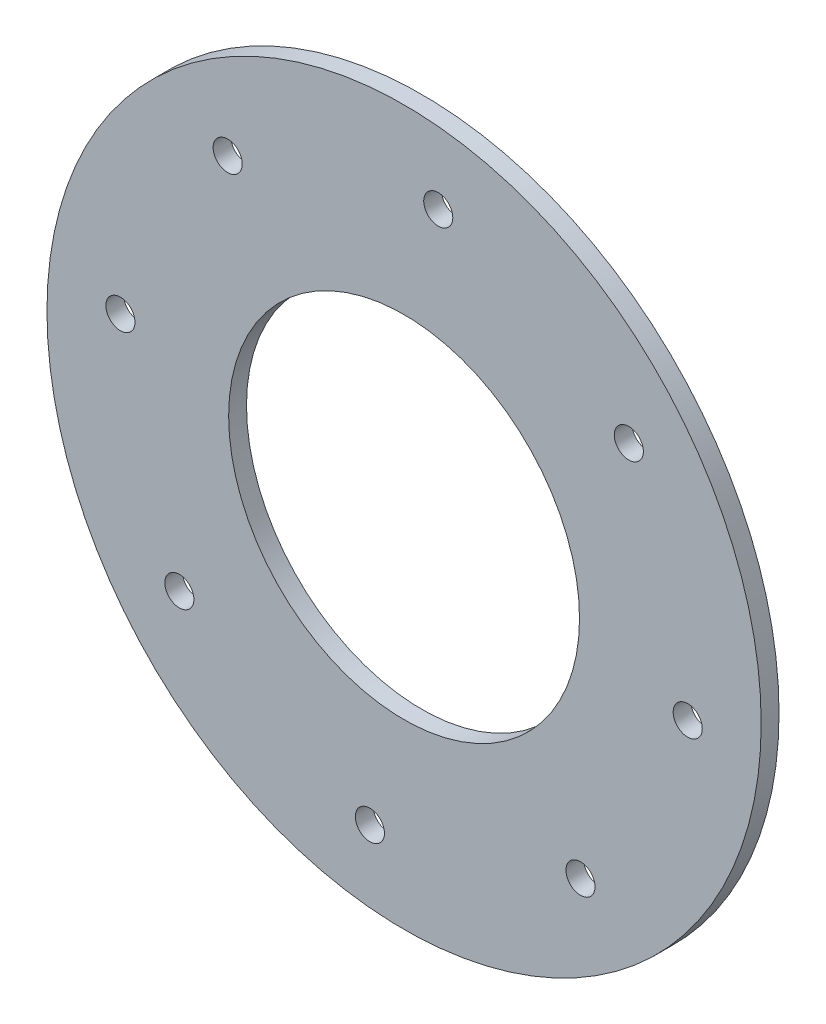
ISO-10303-21;
HEADER;
FILE_DESCRIPTION(('STEP AP214'),'2;1');
FILE_NAME('part.step','',(''),(''),'','','');
FILE_SCHEMA(('AUTOMOTIVE_DESIGN { 1 0 10303 214 1 1 1 1 }'));
ENDSEC;
DATA;
#1=APPLICATION_CONTEXT('core data for automotive mechanical design processes');
#2=APPLICATION_PROTOCOL_DEFINITION('international standard','automotive_design',2000,#1);
#3=PRODUCT_CONTEXT('',#1,'mechanical');
#4=PRODUCT('Part','Part','',(#3));
#5=PRODUCT_RELATED_PRODUCT_CATEGORY('part','',(#4));
#6=PRODUCT_DEFINITION_FORMATION('','',#4);
#7=PRODUCT_DEFINITION_CONTEXT('part definition',#1,'design');
#8=PRODUCT_DEFINITION('design','',#6,#7);
#9=PRODUCT_DEFINITION_SHAPE('','',#8);
#10=(LENGTH_UNIT() NAMED_UNIT(*) SI_UNIT(.MILLI.,.METRE.));
#11=(NAMED_UNIT(*) PLANE_ANGLE_UNIT() SI_UNIT($,.RADIAN.));
#12=(NAMED_UNIT(*) SI_UNIT($,.STERADIAN.) SOLID_ANGLE_UNIT());
#13=UNCERTAINTY_MEASURE_WITH_UNIT(LENGTH_MEASURE(1.E-05),#10,'distance_accuracy_value','');
#14=(GEOMETRIC_REPRESENTATION_CONTEXT(3) GLOBAL_UNCERTAINTY_ASSIGNED_CONTEXT((#13)) GLOBAL_UNIT_ASSIGNED_CONTEXT((#10,
#11,#12)) REPRESENTATION_CONTEXT('',''));
#15=CARTESIAN_POINT('',(0.,0.,0.));
#16=DIRECTION('',(0.,0.,1.));
#17=DIRECTION('',(1.,0.,0.));
#18=AXIS2_PLACEMENT_3D('',#15,#16,#17);
#19=CARTESIAN_POINT('',(0.,0.,3.));
#20=DIRECTION('',(0.,0.,1.));
#21=DIRECTION('',(1.,0.,0.));
#22=AXIS2_PLACEMENT_3D('',#19,#20,#21);
#23=PLANE('',#22);
#24=CARTESIAN_POINT('',(-37.7582746187648,-29.6363408303649,3.));
#25=DIRECTION('',(0.,0.,1.));
#26=DIRECTION('',(1.,0.,0.));
#27=AXIS2_PLACEMENT_3D('',#24,#25,#26);
#28=CIRCLE('',#27,2.44394443382312);
#29=CARTESIAN_POINT('',(-35.3143301849417,-29.6363408303649,3.));
#30=VERTEX_POINT('',#29);
#31=EDGE_CURVE('E108',#30,#30,#28,.T.);
#32=ORIENTED_EDGE('',*,*,#31,.F.);
#33=EDGE_LOOP('',(#32));
#34=FACE_BOUND('',#33,.T.);
#35=CARTESIAN_POINT('',(29.6363408303706,-37.7582746187655,3.));
#36=DIRECTION('',(0.,0.,1.));
#37=DIRECTION('',(1.,0.,0.));
#38=AXIS2_PLACEMENT_3D('',#35,#36,#37);
#39=CIRCLE('',#38,2.44394443382819);
#40=CARTESIAN_POINT('',(32.0802852641988,-37.7582746187655,3.));
#41=VERTEX_POINT('',#40);
#42=EDGE_CURVE('E92',#41,#41,#39,.T.);
#43=ORIENTED_EDGE('',*,*,#42,.F.);
#44=EDGE_LOOP('',(#43));
#45=FACE_BOUND('',#44,.T.);
#46=CARTESIAN_POINT('',(37.7582746187712,29.6363408303699,3.));
#47=DIRECTION('',(0.,0.,1.));
#48=DIRECTION('',(1.,0.,0.));
#49=AXIS2_PLACEMENT_3D('',#46,#47,#48);
#50=CIRCLE('',#49,2.44394443382569);
#51=CARTESIAN_POINT('',(40.2022190525969,29.6363408303699,3.));
#52=VERTEX_POINT('',#51);
#53=EDGE_CURVE('E76',#52,#52,#50,.T.);
#54=ORIENTED_EDGE('',*,*,#53,.F.);
#55=EDGE_LOOP('',(#54));
#56=FACE_BOUND('',#55,.T.);
#57=CARTESIAN_POINT('',(-29.6363408303642,37.7582746187705,3.));
#58=DIRECTION('',(0.,0.,1.));
#59=DIRECTION('',(1.,0.,0.));
#60=AXIS2_PLACEMENT_3D('',#57,#58,#59);
#61=CIRCLE('',#60,2.4439444338203);
#62=CARTESIAN_POINT('',(-27.1923963965439,37.7582746187705,3.));
#63=VERTEX_POINT('',#62);
#64=EDGE_CURVE('E60',#63,#63,#61,.T.);
#65=ORIENTED_EDGE('',*,*,#64,.F.);
#66=EDGE_LOOP('',(#65));
#67=FACE_BOUND('',#66,.T.);
#68=CARTESIAN_POINT('',(0.,0.,3.));
#69=DIRECTION('',(0.,0.,1.));
#70=DIRECTION('',(1.,0.,0.));
#71=AXIS2_PLACEMENT_3D('',#68,#69,#70);
#72=CIRCLE('',#71,60.);
#73=CARTESIAN_POINT('',(60.,0.,3.));
#74=VERTEX_POINT('',#73);
#75=EDGE_CURVE('E10',#74,#74,#72,.T.);
#76=ORIENTED_EDGE('',*,*,#75,.T.);
#77=EDGE_LOOP('',(#76));
#78=FACE_BOUND('',#77,.T.);
#79=CARTESIAN_POINT('',(0.,0.,3.));
#80=DIRECTION('',(0.,0.,1.));
#81=DIRECTION('',(1.,0.,0.));
#82=AXIS2_PLACEMENT_3D('',#79,#80,#81);
#83=CIRCLE('',#82,29.476887992267);
#84=CARTESIAN_POINT('',(29.476887992267,0.,3.));
#85=VERTEX_POINT('',#84);
#86=EDGE_CURVE('E54',#85,#85,#83,.T.);
#87=ORIENTED_EDGE('',*,*,#86,.F.);
#88=EDGE_LOOP('',(#87));
#89=FACE_BOUND('',#88,.T.);
#90=CARTESIAN_POINT('',(5.7430744581294,47.6551895995458,3.));
#91=DIRECTION('',(0.,0.,1.));
#92=DIRECTION('',(1.,0.,0.));
#93=AXIS2_PLACEMENT_3D('',#90,#91,#92);
#94=CIRCLE('',#93,2.4439444338225);
#95=CARTESIAN_POINT('',(8.1870188919519,47.6551895995458,3.));
#96=VERTEX_POINT('',#95);
#97=EDGE_CURVE('E68',#96,#96,#94,.T.);
#98=ORIENTED_EDGE('',*,*,#97,.F.);
#99=EDGE_LOOP('',(#98));
#100=FACE_BOUND('',#99,.T.);
#101=CARTESIAN_POINT('',(47.6551895995465,-5.74307445812371,3.));
#102=DIRECTION('',(0.,0.,1.));
#103=DIRECTION('',(1.,0.,0.));
#104=AXIS2_PLACEMENT_3D('',#101,#102,#103);
#105=CIRCLE('',#104,2.44394443382802);
#106=CARTESIAN_POINT('',(50.0991340333745,-5.74307445812371,3.));
#107=VERTEX_POINT('',#106);
#108=EDGE_CURVE('E84',#107,#107,#105,.T.);
#109=ORIENTED_EDGE('',*,*,#108,.F.);
#110=EDGE_LOOP('',(#109));
#111=FACE_BOUND('',#110,.T.);
#112=CARTESIAN_POINT('',(-5.743074458123,-47.6551895995408,3.));
#113=DIRECTION('',(0.,0.,1.));
#114=DIRECTION('',(1.,0.,0.));
#115=AXIS2_PLACEMENT_3D('',#112,#113,#114);
#116=CIRCLE('',#115,2.44394443382614);
#117=CARTESIAN_POINT('',(-3.29913002429685,-47.6551895995408,3.));
#118=VERTEX_POINT('',#117);
#119=EDGE_CURVE('E100',#118,#118,#116,.T.);
#120=ORIENTED_EDGE('',*,*,#119,.F.);
#121=EDGE_LOOP('',(#120));
#122=FACE_BOUND('',#121,.T.);
#123=CARTESIAN_POINT('',(-47.6551895995401,5.74307445812868,3.));
#124=DIRECTION('',(0.,0.,1.));
#125=DIRECTION('',(1.,0.,0.));
#126=AXIS2_PLACEMENT_3D('',#123,#124,#125);
#127=CIRCLE('',#126,2.44394443382094);
#128=CARTESIAN_POINT('',(-45.2112451657192,5.74307445812868,3.));
#129=VERTEX_POINT('',#128);
#130=EDGE_CURVE('E116',#129,#129,#127,.T.);
#131=ORIENTED_EDGE('',*,*,#130,.F.);
#132=EDGE_LOOP('',(#131));
#133=FACE_BOUND('',#132,.T.);
#134=ADVANCED_FACE('F41',(#34,#45,#56,#67,#78,#89,#100,#111,#122,#133),#23,.T.);
#135=CARTESIAN_POINT('',(0.,0.,0.));
#136=DIRECTION('',(0.,0.,1.));
#137=DIRECTION('',(1.,0.,0.));
#138=AXIS2_PLACEMENT_3D('',#135,#136,#137);
#139=PLANE('',#138);
#140=CARTESIAN_POINT('',(0.,0.,0.));
#141=DIRECTION('',(0.,0.,1.));
#142=DIRECTION('',(1.,0.,0.));
#143=AXIS2_PLACEMENT_3D('',#140,#141,#142);
#144=CIRCLE('',#143,60.);
#145=CARTESIAN_POINT('',(60.,0.,0.));
#146=VERTEX_POINT('',#145);
#147=EDGE_CURVE('E45',#146,#146,#144,.T.);
#148=ORIENTED_EDGE('',*,*,#147,.F.);
#149=EDGE_LOOP('',(#148));
#150=FACE_BOUND('',#149,.T.);
#151=CARTESIAN_POINT('',(0.,0.,0.));
#152=DIRECTION('',(0.,0.,1.));
#153=DIRECTION('',(1.,0.,0.));
#154=AXIS2_PLACEMENT_3D('',#151,#152,#153);
#155=CIRCLE('',#154,29.476887992267);
#156=CARTESIAN_POINT('',(29.476887992267,0.,0.));
#157=VERTEX_POINT('',#156);
#158=EDGE_CURVE('E56',#157,#157,#155,.T.);
#159=ORIENTED_EDGE('',*,*,#158,.T.);
#160=EDGE_LOOP('',(#159));
#161=FACE_BOUND('',#160,.T.);
#162=CARTESIAN_POINT('',(-29.6363408303642,37.7582746187705,0.));
#163=DIRECTION('',(0.,0.,1.));
#164=DIRECTION('',(1.,0.,0.));
#165=AXIS2_PLACEMENT_3D('',#162,#163,#164);
#166=CIRCLE('',#165,2.4439444338203);
#167=CARTESIAN_POINT('',(-27.1923963965439,37.7582746187705,0.));
#168=VERTEX_POINT('',#167);
#169=EDGE_CURVE('E64',#168,#168,#166,.T.);
#170=ORIENTED_EDGE('',*,*,#169,.T.);
#171=EDGE_LOOP('',(#170));
#172=FACE_BOUND('',#171,.T.);
#173=CARTESIAN_POINT('',(5.7430744581294,47.6551895995458,0.));
#174=DIRECTION('',(0.,0.,1.));
#175=DIRECTION('',(1.,0.,0.));
#176=AXIS2_PLACEMENT_3D('',#173,#174,#175);
#177=CIRCLE('',#176,2.4439444338225);
#178=CARTESIAN_POINT('',(8.1870188919519,47.6551895995458,0.));
#179=VERTEX_POINT('',#178);
#180=EDGE_CURVE('E72',#179,#179,#177,.T.);
#181=ORIENTED_EDGE('',*,*,#180,.T.);
#182=EDGE_LOOP('',(#181));
#183=FACE_BOUND('',#182,.T.);
#184=CARTESIAN_POINT('',(37.7582746187712,29.6363408303699,0.));
#185=DIRECTION('',(0.,0.,1.));
#186=DIRECTION('',(1.,0.,0.));
#187=AXIS2_PLACEMENT_3D('',#184,#185,#186);
#188=CIRCLE('',#187,2.44394443382569);
#189=CARTESIAN_POINT('',(40.2022190525969,29.6363408303699,0.));
#190=VERTEX_POINT('',#189);
#191=EDGE_CURVE('E80',#190,#190,#188,.T.);
#192=ORIENTED_EDGE('',*,*,#191,.T.);
#193=EDGE_LOOP('',(#192));
#194=FACE_BOUND('',#193,.T.);
#195=CARTESIAN_POINT('',(47.6551895995465,-5.74307445812371,0.));
#196=DIRECTION('',(0.,0.,1.));
#197=DIRECTION('',(1.,0.,0.));
#198=AXIS2_PLACEMENT_3D('',#195,#196,#197);
#199=CIRCLE('',#198,2.44394443382802);
#200=CARTESIAN_POINT('',(50.0991340333745,-5.74307445812371,0.));
#201=VERTEX_POINT('',#200);
#202=EDGE_CURVE('E88',#201,#201,#199,.T.);
#203=ORIENTED_EDGE('',*,*,#202,.T.);
#204=EDGE_LOOP('',(#203));
#205=FACE_BOUND('',#204,.T.);
#206=CARTESIAN_POINT('',(29.6363408303706,-37.7582746187655,0.));
#207=DIRECTION('',(0.,0.,1.));
#208=DIRECTION('',(1.,0.,0.));
#209=AXIS2_PLACEMENT_3D('',#206,#207,#208);
#210=CIRCLE('',#209,2.44394443382819);
#211=CARTESIAN_POINT('',(32.0802852641988,-37.7582746187655,0.));
#212=VERTEX_POINT('',#211);
#213=EDGE_CURVE('E96',#212,#212,#210,.T.);
#214=ORIENTED_EDGE('',*,*,#213,.T.);
#215=EDGE_LOOP('',(#214));
#216=FACE_BOUND('',#215,.T.);
#217=CARTESIAN_POINT('',(-5.743074458123,-47.6551895995408,0.));
#218=DIRECTION('',(0.,0.,1.));
#219=DIRECTION('',(1.,0.,0.));
#220=AXIS2_PLACEMENT_3D('',#217,#218,#219);
#221=CIRCLE('',#220,2.44394443382614);
#222=CARTESIAN_POINT('',(-3.29913002429685,-47.6551895995408,0.));
#223=VERTEX_POINT('',#222);
#224=EDGE_CURVE('E104',#223,#223,#221,.T.);
#225=ORIENTED_EDGE('',*,*,#224,.T.);
#226=EDGE_LOOP('',(#225));
#227=FACE_BOUND('',#226,.T.);
#228=CARTESIAN_POINT('',(-37.7582746187648,-29.6363408303649,0.));
#229=DIRECTION('',(0.,0.,1.));
#230=DIRECTION('',(1.,0.,0.));
#231=AXIS2_PLACEMENT_3D('',#228,#229,#230);
#232=CIRCLE('',#231,2.44394443382312);
#233=CARTESIAN_POINT('',(-35.3143301849417,-29.6363408303649,0.));
#234=VERTEX_POINT('',#233);
#235=EDGE_CURVE('E112',#234,#234,#232,.T.);
#236=ORIENTED_EDGE('',*,*,#235,.T.);
#237=EDGE_LOOP('',(#236));
#238=FACE_BOUND('',#237,.T.);
#239=CARTESIAN_POINT('',(-47.6551895995401,5.74307445812868,0.));
#240=DIRECTION('',(0.,0.,1.));
#241=DIRECTION('',(1.,0.,0.));
#242=AXIS2_PLACEMENT_3D('',#239,#240,#241);
#243=CIRCLE('',#242,2.44394443382094);
#244=CARTESIAN_POINT('',(-45.2112451657192,5.74307445812868,0.));
#245=VERTEX_POINT('',#244);
#246=EDGE_CURVE('E120',#245,#245,#243,.T.);
#247=ORIENTED_EDGE('',*,*,#246,.T.);
#248=EDGE_LOOP('',(#247));
#249=FACE_BOUND('',#248,.T.);
#250=ADVANCED_FACE('F132',(#150,#161,#172,#183,#194,#205,#216,#227,#238,#249),#139,.F.);
#251=CARTESIAN_POINT('',(0.,0.,3.));
#252=DIRECTION('',(0.,0.,-1.));
#253=DIRECTION('',(-1.,0.,0.));
#254=AXIS2_PLACEMENT_3D('',#251,#252,#253);
#255=CYLINDRICAL_SURFACE('',#254,60.);
#256=ORIENTED_EDGE('',*,*,#75,.F.);
#257=EDGE_LOOP('',(#256));
#258=FACE_BOUND('',#257,.T.);
#259=ORIENTED_EDGE('',*,*,#147,.T.);
#260=EDGE_LOOP('',(#259));
#261=FACE_BOUND('',#260,.T.);
#262=ADVANCED_FACE('F43',(#258,#261),#255,.T.);
#263=CARTESIAN_POINT('',(0.,0.,3.));
#264=DIRECTION('',(0.,0.,-1.));
#265=DIRECTION('',(-1.,0.,0.));
#266=AXIS2_PLACEMENT_3D('',#263,#264,#265);
#267=CYLINDRICAL_SURFACE('',#266,29.476887992267);
#268=ORIENTED_EDGE('',*,*,#86,.T.);
#269=EDGE_LOOP('',(#268));
#270=FACE_BOUND('',#269,.T.);
#271=ORIENTED_EDGE('',*,*,#158,.F.);
#272=EDGE_LOOP('',(#271));
#273=FACE_BOUND('',#272,.T.);
#274=ADVANCED_FACE('F142',(#270,#273),#267,.F.);
#275=CARTESIAN_POINT('',(-29.6363408303642,37.7582746187705,3.));
#276=DIRECTION('',(0.,0.,-1.));
#277=DIRECTION('',(-1.,0.,0.));
#278=AXIS2_PLACEMENT_3D('',#275,#276,#277);
#279=CYLINDRICAL_SURFACE('',#278,2.4439444338203);
#280=ORIENTED_EDGE('',*,*,#64,.T.);
#281=EDGE_LOOP('',(#280));
#282=FACE_BOUND('',#281,.T.);
#283=ORIENTED_EDGE('',*,*,#169,.F.);
#284=EDGE_LOOP('',(#283));
#285=FACE_BOUND('',#284,.T.);
#286=ADVANCED_FACE('F145',(#282,#285),#279,.F.);
#287=CARTESIAN_POINT('',(5.7430744581294,47.6551895995458,3.));
#288=DIRECTION('',(0.,0.,-1.));
#289=DIRECTION('',(-1.,0.,0.));
#290=AXIS2_PLACEMENT_3D('',#287,#288,#289);
#291=CYLINDRICAL_SURFACE('',#290,2.4439444338225);
#292=ORIENTED_EDGE('',*,*,#97,.T.);
#293=EDGE_LOOP('',(#292));
#294=FACE_BOUND('',#293,.T.);
#295=ORIENTED_EDGE('',*,*,#180,.F.);
#296=EDGE_LOOP('',(#295));
#297=FACE_BOUND('',#296,.T.);
#298=ADVANCED_FACE('F149',(#294,#297),#291,.F.);
#299=CARTESIAN_POINT('',(37.7582746187712,29.6363408303699,3.));
#300=DIRECTION('',(0.,0.,-1.));
#301=DIRECTION('',(-1.,0.,0.));
#302=AXIS2_PLACEMENT_3D('',#299,#300,#301);
#303=CYLINDRICAL_SURFACE('',#302,2.44394443382569);
#304=ORIENTED_EDGE('',*,*,#53,.T.);
#305=EDGE_LOOP('',(#304));
#306=FACE_BOUND('',#305,.T.);
#307=ORIENTED_EDGE('',*,*,#191,.F.);
#308=EDGE_LOOP('',(#307));
#309=FACE_BOUND('',#308,.T.);
#310=ADVANCED_FACE('F153',(#306,#309),#303,.F.);
#311=CARTESIAN_POINT('',(47.6551895995465,-5.74307445812371,3.));
#312=DIRECTION('',(0.,0.,-1.));
#313=DIRECTION('',(-1.,0.,0.));
#314=AXIS2_PLACEMENT_3D('',#311,#312,#313);
#315=CYLINDRICAL_SURFACE('',#314,2.44394443382802);
#316=ORIENTED_EDGE('',*,*,#108,.T.);
#317=EDGE_LOOP('',(#316));
#318=FACE_BOUND('',#317,.T.);
#319=ORIENTED_EDGE('',*,*,#202,.F.);
#320=EDGE_LOOP('',(#319));
#321=FACE_BOUND('',#320,.T.);
#322=ADVANCED_FACE('F157',(#318,#321),#315,.F.);
#323=CARTESIAN_POINT('',(29.6363408303706,-37.7582746187655,3.));
#324=DIRECTION('',(0.,0.,-1.));
#325=DIRECTION('',(-1.,0.,0.));
#326=AXIS2_PLACEMENT_3D('',#323,#324,#325);
#327=CYLINDRICAL_SURFACE('',#326,2.44394443382819);
#328=ORIENTED_EDGE('',*,*,#42,.T.);
#329=EDGE_LOOP('',(#328));
#330=FACE_BOUND('',#329,.T.);
#331=ORIENTED_EDGE('',*,*,#213,.F.);
#332=EDGE_LOOP('',(#331));
#333=FACE_BOUND('',#332,.T.);
#334=ADVANCED_FACE('F161',(#330,#333),#327,.F.);
#335=CARTESIAN_POINT('',(-5.743074458123,-47.6551895995408,3.));
#336=DIRECTION('',(0.,0.,-1.));
#337=DIRECTION('',(-1.,0.,0.));
#338=AXIS2_PLACEMENT_3D('',#335,#336,#337);
#339=CYLINDRICAL_SURFACE('',#338,2.44394443382614);
#340=ORIENTED_EDGE('',*,*,#119,.T.);
#341=EDGE_LOOP('',(#340));
#342=FACE_BOUND('',#341,.T.);
#343=ORIENTED_EDGE('',*,*,#224,.F.);
#344=EDGE_LOOP('',(#343));
#345=FACE_BOUND('',#344,.T.);
#346=ADVANCED_FACE('F165',(#342,#345),#339,.F.);
#347=CARTESIAN_POINT('',(-37.7582746187648,-29.6363408303649,3.));
#348=DIRECTION('',(0.,0.,-1.));
#349=DIRECTION('',(-1.,0.,0.));
#350=AXIS2_PLACEMENT_3D('',#347,#348,#349);
#351=CYLINDRICAL_SURFACE('',#350,2.44394443382312);
#352=ORIENTED_EDGE('',*,*,#31,.T.);
#353=EDGE_LOOP('',(#352));
#354=FACE_BOUND('',#353,.T.);
#355=ORIENTED_EDGE('',*,*,#235,.F.);
#356=EDGE_LOOP('',(#355));
#357=FACE_BOUND('',#356,.T.);
#358=ADVANCED_FACE('F169',(#354,#357),#351,.F.);
#359=CARTESIAN_POINT('',(-47.6551895995401,5.74307445812868,3.));
#360=DIRECTION('',(0.,0.,-1.));
#361=DIRECTION('',(-1.,0.,0.));
#362=AXIS2_PLACEMENT_3D('',#359,#360,#361);
#363=CYLINDRICAL_SURFACE('',#362,2.44394443382094);
#364=ORIENTED_EDGE('',*,*,#130,.T.);
#365=EDGE_LOOP('',(#364));
#366=FACE_BOUND('',#365,.T.);
#367=ORIENTED_EDGE('',*,*,#246,.F.);
#368=EDGE_LOOP('',(#367));
#369=FACE_BOUND('',#368,.T.);
#370=ADVANCED_FACE('F128',(#366,#369),#363,.F.);
#371=CLOSED_SHELL('',(#134,#250,#262,#274,#286,#298,#310,#322,#334,#346,#358,#370));
#372=MANIFOLD_SOLID_BREP('B2',#371);
#373=ADVANCED_BREP_SHAPE_REPRESENTATION('',(#18,#372),#14);
#374=SHAPE_DEFINITION_REPRESENTATION(#9,#373);
ENDSEC;
END-ISO-10303-21;
